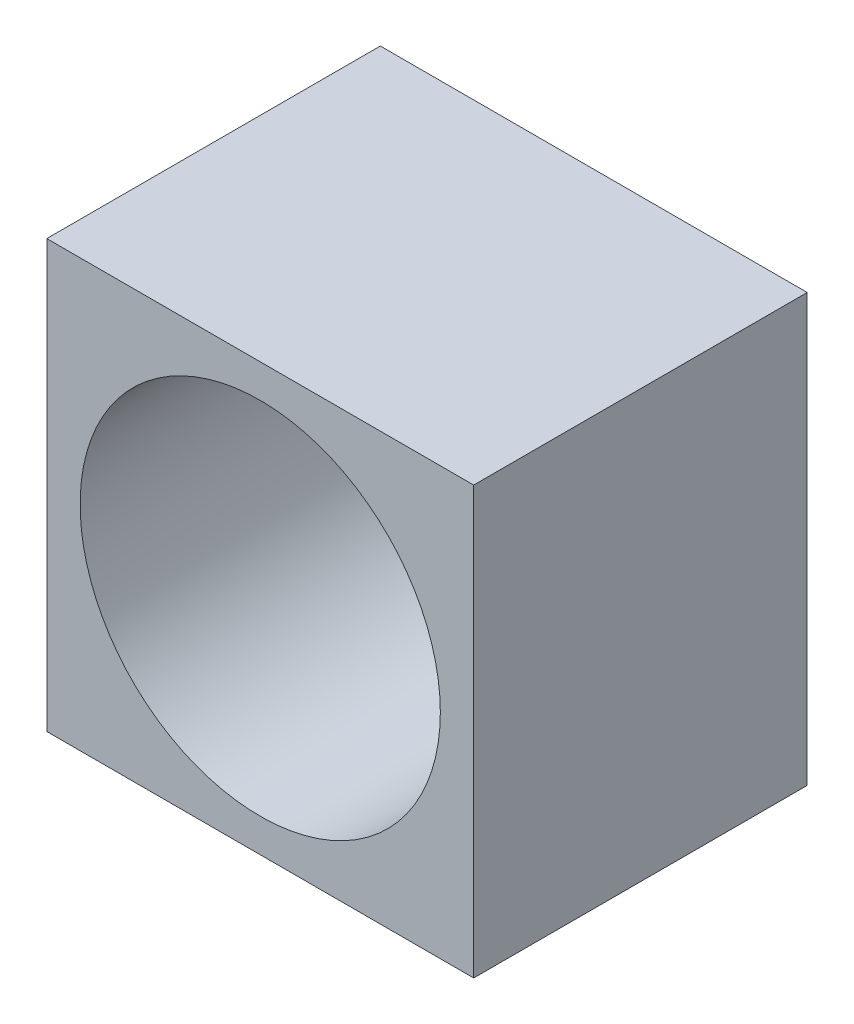
ISO-10303-21;
HEADER;
FILE_DESCRIPTION(('STEP AP214'),'2;1');
FILE_NAME('part.step','',(''),(''),'','','');
FILE_SCHEMA(('AUTOMOTIVE_DESIGN { 1 0 10303 214 1 1 1 1 }'));
ENDSEC;
DATA;
#1=APPLICATION_CONTEXT('core data for automotive mechanical design processes');
#2=APPLICATION_PROTOCOL_DEFINITION('international standard','automotive_design',2000,#1);
#3=PRODUCT_CONTEXT('',#1,'mechanical');
#4=PRODUCT('Part','Part','',(#3));
#5=PRODUCT_RELATED_PRODUCT_CATEGORY('part','',(#4));
#6=PRODUCT_DEFINITION_FORMATION('','',#4);
#7=PRODUCT_DEFINITION_CONTEXT('part definition',#1,'design');
#8=PRODUCT_DEFINITION('design','',#6,#7);
#9=PRODUCT_DEFINITION_SHAPE('','',#8);
#10=(LENGTH_UNIT() NAMED_UNIT(*) SI_UNIT(.MILLI.,.METRE.));
#11=(NAMED_UNIT(*) PLANE_ANGLE_UNIT() SI_UNIT($,.RADIAN.));
#12=(NAMED_UNIT(*) SI_UNIT($,.STERADIAN.) SOLID_ANGLE_UNIT());
#13=UNCERTAINTY_MEASURE_WITH_UNIT(LENGTH_MEASURE(1.E-05),#10,'distance_accuracy_value','');
#14=(GEOMETRIC_REPRESENTATION_CONTEXT(3) GLOBAL_UNCERTAINTY_ASSIGNED_CONTEXT((#13)) GLOBAL_UNIT_ASSIGNED_CONTEXT((#10,
#11,#12)) REPRESENTATION_CONTEXT('',''));
#15=CARTESIAN_POINT('',(0.,0.,0.));
#16=DIRECTION('',(0.,0.,1.));
#17=DIRECTION('',(1.,0.,0.));
#18=AXIS2_PLACEMENT_3D('',#15,#16,#17);
#19=CARTESIAN_POINT('',(16.,16.,25.));
#20=DIRECTION('',(-1.,0.,0.));
#21=DIRECTION('',(0.,-1.,0.));
#22=AXIS2_PLACEMENT_3D('',#19,#20,#21);
#23=PLANE('',#22);
#24=DIRECTION('',(0.,1.,0.));
#25=VECTOR('',#24,1.);
#26=CARTESIAN_POINT('',(16.,16.,0.));
#27=LINE('',#26,#25);
#28=CARTESIAN_POINT('',(16.,-16.,0.));
#29=VERTEX_POINT('',#28);
#30=CARTESIAN_POINT('',(16.,16.,0.));
#31=VERTEX_POINT('',#30);
#32=EDGE_CURVE('E98',#29,#31,#27,.T.);
#33=ORIENTED_EDGE('',*,*,#32,.T.);
#34=DIRECTION('',(0.,0.,-1.));
#35=VECTOR('',#34,1.);
#36=CARTESIAN_POINT('',(16.,16.,25.));
#37=LINE('',#36,#35);
#38=CARTESIAN_POINT('',(16.,16.,25.));
#39=VERTEX_POINT('',#38);
#40=EDGE_CURVE('E11',#39,#31,#37,.T.);
#41=ORIENTED_EDGE('',*,*,#40,.F.);
#42=DIRECTION('',(0.,1.,0.));
#43=VECTOR('',#42,1.);
#44=CARTESIAN_POINT('',(16.,16.,25.));
#45=LINE('',#44,#43);
#46=CARTESIAN_POINT('',(16.,-16.,25.));
#47=VERTEX_POINT('',#46);
#48=EDGE_CURVE('E86',#47,#39,#45,.T.);
#49=ORIENTED_EDGE('',*,*,#48,.F.);
#50=DIRECTION('',(0.,0.,-1.));
#51=VECTOR('',#50,1.);
#52=CARTESIAN_POINT('',(16.,-16.,25.));
#53=LINE('',#52,#51);
#54=EDGE_CURVE('E94',#47,#29,#53,.T.);
#55=ORIENTED_EDGE('',*,*,#54,.T.);
#56=EDGE_LOOP('',(#33,#41,#49,#55));
#57=FACE_BOUND('',#56,.T.);
#58=ADVANCED_FACE('F35',(#57),#23,.F.);
#59=CARTESIAN_POINT('',(-16.,16.,25.));
#60=DIRECTION('',(0.,-1.,0.));
#61=DIRECTION('',(0.,0.,-1.));
#62=AXIS2_PLACEMENT_3D('',#59,#60,#61);
#63=PLANE('',#62);
#64=DIRECTION('',(-1.,0.,0.));
#65=VECTOR('',#64,1.);
#66=CARTESIAN_POINT('',(-16.,16.,0.));
#67=LINE('',#66,#65);
#68=CARTESIAN_POINT('',(-16.,16.,0.));
#69=VERTEX_POINT('',#68);
#70=EDGE_CURVE('E90',#31,#69,#67,.T.);
#71=ORIENTED_EDGE('',*,*,#70,.T.);
#72=DIRECTION('',(0.,0.,-1.));
#73=VECTOR('',#72,1.);
#74=CARTESIAN_POINT('',(-16.,16.,25.));
#75=LINE('',#74,#73);
#76=CARTESIAN_POINT('',(-16.,16.,25.));
#77=VERTEX_POINT('',#76);
#78=EDGE_CURVE('E43',#77,#69,#75,.T.);
#79=ORIENTED_EDGE('',*,*,#78,.F.);
#80=DIRECTION('',(-1.,0.,0.));
#81=VECTOR('',#80,1.);
#82=CARTESIAN_POINT('',(-16.,16.,25.));
#83=LINE('',#82,#81);
#84=EDGE_CURVE('E81',#39,#77,#83,.T.);
#85=ORIENTED_EDGE('',*,*,#84,.F.);
#86=ORIENTED_EDGE('',*,*,#40,.T.);
#87=EDGE_LOOP('',(#71,#79,#85,#86));
#88=FACE_BOUND('',#87,.T.);
#89=ADVANCED_FACE('F89',(#88),#63,.F.);
#90=CARTESIAN_POINT('',(-16.,16.,25.));
#91=DIRECTION('',(1.,0.,0.));
#92=DIRECTION('',(0.,0.,-1.));
#93=AXIS2_PLACEMENT_3D('',#90,#91,#92);
#94=PLANE('',#93);
#95=DIRECTION('',(0.,-1.,0.));
#96=VECTOR('',#95,1.);
#97=CARTESIAN_POINT('',(-16.,16.,0.));
#98=LINE('',#97,#96);
#99=CARTESIAN_POINT('',(-16.,-16.,0.));
#100=VERTEX_POINT('',#99);
#101=EDGE_CURVE('E68',#69,#100,#98,.T.);
#102=ORIENTED_EDGE('',*,*,#101,.T.);
#103=DIRECTION('',(0.,0.,-1.));
#104=VECTOR('',#103,1.);
#105=CARTESIAN_POINT('',(-16.,-16.,25.));
#106=LINE('',#105,#104);
#107=CARTESIAN_POINT('',(-16.,-16.,25.));
#108=VERTEX_POINT('',#107);
#109=EDGE_CURVE('E91',#108,#100,#106,.T.);
#110=ORIENTED_EDGE('',*,*,#109,.F.);
#111=DIRECTION('',(0.,-1.,0.));
#112=VECTOR('',#111,1.);
#113=CARTESIAN_POINT('',(-16.,16.,25.));
#114=LINE('',#113,#112);
#115=EDGE_CURVE('E84',#77,#108,#114,.T.);
#116=ORIENTED_EDGE('',*,*,#115,.F.);
#117=ORIENTED_EDGE('',*,*,#78,.T.);
#118=EDGE_LOOP('',(#102,#110,#116,#117));
#119=FACE_BOUND('',#118,.T.);
#120=ADVANCED_FACE('F92',(#119),#94,.F.);
#121=CARTESIAN_POINT('',(-16.,-16.,25.));
#122=DIRECTION('',(0.,1.,0.));
#123=DIRECTION('',(0.,0.,1.));
#124=AXIS2_PLACEMENT_3D('',#121,#122,#123);
#125=PLANE('',#124);
#126=DIRECTION('',(1.,0.,0.));
#127=VECTOR('',#126,1.);
#128=CARTESIAN_POINT('',(-16.,-16.,0.));
#129=LINE('',#128,#127);
#130=EDGE_CURVE('E74',#100,#29,#129,.T.);
#131=ORIENTED_EDGE('',*,*,#130,.T.);
#132=ORIENTED_EDGE('',*,*,#54,.F.);
#133=DIRECTION('',(1.,0.,0.));
#134=VECTOR('',#133,1.);
#135=CARTESIAN_POINT('',(-16.,-16.,25.));
#136=LINE('',#135,#134);
#137=EDGE_CURVE('E51',#108,#47,#136,.T.);
#138=ORIENTED_EDGE('',*,*,#137,.F.);
#139=ORIENTED_EDGE('',*,*,#109,.T.);
#140=EDGE_LOOP('',(#131,#132,#138,#139));
#141=FACE_BOUND('',#140,.T.);
#142=ADVANCED_FACE('F106',(#141),#125,.F.);
#143=CARTESIAN_POINT('',(0.,0.,25.));
#144=DIRECTION('',(0.,0.,1.));
#145=DIRECTION('',(1.,0.,0.));
#146=AXIS2_PLACEMENT_3D('',#143,#144,#145);
#147=PLANE('',#146);
#148=CARTESIAN_POINT('',(0.,0.,25.));
#149=DIRECTION('',(0.,0.,1.));
#150=DIRECTION('',(1.,0.,0.));
#151=AXIS2_PLACEMENT_3D('',#148,#149,#150);
#152=CIRCLE('',#151,13.5);
#153=CARTESIAN_POINT('',(13.5,0.,25.));
#154=VERTEX_POINT('',#153);
#155=EDGE_CURVE('E112',#154,#154,#152,.T.);
#156=ORIENTED_EDGE('',*,*,#155,.F.);
#157=EDGE_LOOP('',(#156));
#158=FACE_BOUND('',#157,.T.);
#159=ORIENTED_EDGE('',*,*,#48,.T.);
#160=ORIENTED_EDGE('',*,*,#84,.T.);
#161=ORIENTED_EDGE('',*,*,#115,.T.);
#162=ORIENTED_EDGE('',*,*,#137,.T.);
#163=EDGE_LOOP('',(#159,#160,#161,#162));
#164=FACE_BOUND('',#163,.T.);
#165=ADVANCED_FACE('F82',(#158,#164),#147,.T.);
#166=CARTESIAN_POINT('',(0.,0.,0.));
#167=DIRECTION('',(0.,0.,1.));
#168=DIRECTION('',(1.,0.,0.));
#169=AXIS2_PLACEMENT_3D('',#166,#167,#168);
#170=PLANE('',#169);
#171=CARTESIAN_POINT('',(0.,0.,0.));
#172=DIRECTION('',(0.,0.,1.));
#173=DIRECTION('',(1.,0.,0.));
#174=AXIS2_PLACEMENT_3D('',#171,#172,#173);
#175=CIRCLE('',#174,13.5);
#176=CARTESIAN_POINT('',(13.5,0.,0.));
#177=VERTEX_POINT('',#176);
#178=EDGE_CURVE('E101',#177,#177,#175,.T.);
#179=ORIENTED_EDGE('',*,*,#178,.T.);
#180=EDGE_LOOP('',(#179));
#181=FACE_BOUND('',#180,.T.);
#182=ORIENTED_EDGE('',*,*,#32,.F.);
#183=ORIENTED_EDGE('',*,*,#130,.F.);
#184=ORIENTED_EDGE('',*,*,#101,.F.);
#185=ORIENTED_EDGE('',*,*,#70,.F.);
#186=EDGE_LOOP('',(#182,#183,#184,#185));
#187=FACE_BOUND('',#186,.T.);
#188=ADVANCED_FACE('F109',(#181,#187),#170,.F.);
#189=CARTESIAN_POINT('',(0.,0.,0.));
#190=DIRECTION('',(0.,0.,1.));
#191=DIRECTION('',(1.,0.,0.));
#192=AXIS2_PLACEMENT_3D('',#189,#190,#191);
#193=CYLINDRICAL_SURFACE('',#192,13.5);
#194=ORIENTED_EDGE('',*,*,#178,.F.);
#195=EDGE_LOOP('',(#194));
#196=FACE_BOUND('',#195,.T.);
#197=ORIENTED_EDGE('',*,*,#155,.T.);
#198=EDGE_LOOP('',(#197));
#199=FACE_BOUND('',#198,.T.);
#200=ADVANCED_FACE('F119',(#196,#199),#193,.F.);
#201=CLOSED_SHELL('',(#58,#89,#120,#142,#165,#188,#200));
#202=MANIFOLD_SOLID_BREP('B2',#201);
#203=ADVANCED_BREP_SHAPE_REPRESENTATION('',(#18,#202),#14);
#204=SHAPE_DEFINITION_REPRESENTATION(#9,#203);
ENDSEC;
END-ISO-10303-21;
